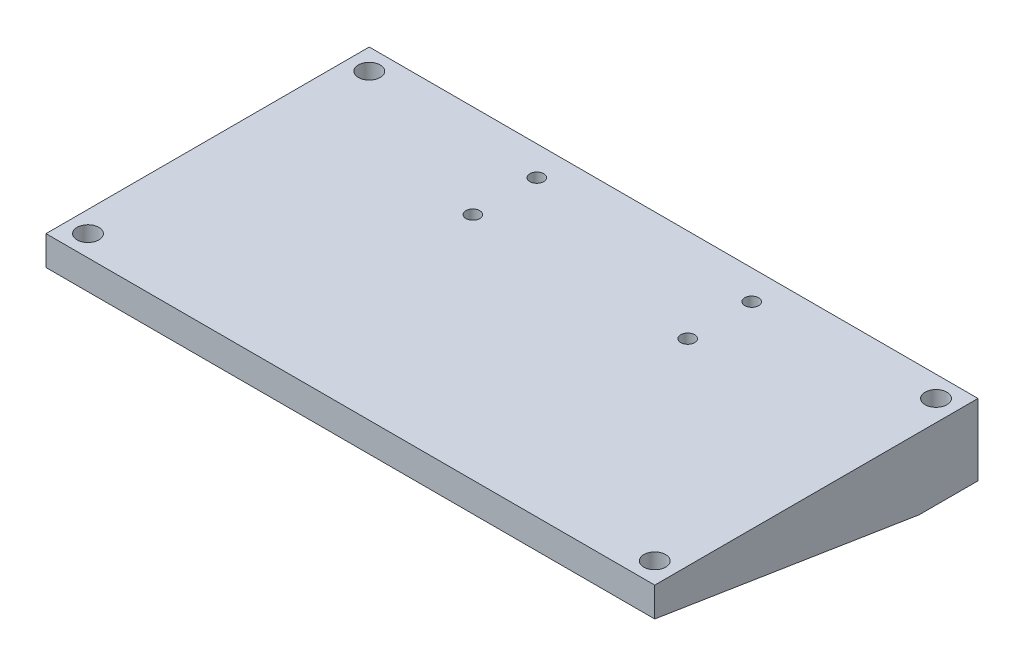
ISO-10303-21;
HEADER;
FILE_DESCRIPTION(('STEP AP214'),'2;1');
FILE_NAME('part.step','',(''),(''),'','','');
FILE_SCHEMA(('AUTOMOTIVE_DESIGN { 1 0 10303 214 1 1 1 1 }'));
ENDSEC;
DATA;
#1=APPLICATION_CONTEXT('core data for automotive mechanical design processes');
#2=APPLICATION_PROTOCOL_DEFINITION('international standard','automotive_design',2000,#1);
#3=PRODUCT_CONTEXT('',#1,'mechanical');
#4=PRODUCT('Part','Part','',(#3));
#5=PRODUCT_RELATED_PRODUCT_CATEGORY('part','',(#4));
#6=PRODUCT_DEFINITION_FORMATION('','',#4);
#7=PRODUCT_DEFINITION_CONTEXT('part definition',#1,'design');
#8=PRODUCT_DEFINITION('design','',#6,#7);
#9=PRODUCT_DEFINITION_SHAPE('','',#8);
#10=(LENGTH_UNIT() NAMED_UNIT(*) SI_UNIT(.MILLI.,.METRE.));
#11=(NAMED_UNIT(*) PLANE_ANGLE_UNIT() SI_UNIT($,.RADIAN.));
#12=(NAMED_UNIT(*) SI_UNIT($,.STERADIAN.) SOLID_ANGLE_UNIT());
#13=UNCERTAINTY_MEASURE_WITH_UNIT(LENGTH_MEASURE(1.E-05),#10,'distance_accuracy_value','');
#14=(GEOMETRIC_REPRESENTATION_CONTEXT(3) GLOBAL_UNCERTAINTY_ASSIGNED_CONTEXT((#13)) GLOBAL_UNIT_ASSIGNED_CONTEXT((#10,
#11,#12)) REPRESENTATION_CONTEXT('',''));
#15=CARTESIAN_POINT('',(0.,0.,0.));
#16=DIRECTION('',(0.,0.,1.));
#17=DIRECTION('',(1.,0.,0.));
#18=AXIS2_PLACEMENT_3D('',#15,#16,#17);
#19=CARTESIAN_POINT('',(0.,17.,0.));
#20=DIRECTION('',(1.,0.,0.));
#21=DIRECTION('',(0.,0.,-1.));
#22=AXIS2_PLACEMENT_3D('',#19,#20,#21);
#23=PLANE('',#22);
#24=DIRECTION('',(0.,0.,1.));
#25=VECTOR('',#24,1.);
#26=CARTESIAN_POINT('',(0.,0.,0.));
#27=LINE('',#26,#25);
#28=CARTESIAN_POINT('',(0.,0.,-77.));
#29=VERTEX_POINT('',#28);
#30=CARTESIAN_POINT('',(0.,0.,-63.0000000000014));
#31=VERTEX_POINT('',#30);
#32=EDGE_CURVE('E116',#29,#31,#27,.T.);
#33=ORIENTED_EDGE('',*,*,#32,.T.);
#34=DIRECTION('',(0.,0.156767544200705,0.987635528464463));
#35=VECTOR('',#34,1.);
#36=CARTESIAN_POINT('',(0.,10.,0.));
#37=LINE('',#36,#35);
#38=CARTESIAN_POINT('',(0.,10.,0.));
#39=VERTEX_POINT('',#38);
#40=EDGE_CURVE('E11',#31,#39,#37,.T.);
#41=ORIENTED_EDGE('',*,*,#40,.T.);
#42=DIRECTION('',(0.,-1.,0.));
#43=VECTOR('',#42,1.);
#44=CARTESIAN_POINT('',(0.,17.,0.));
#45=LINE('',#44,#43);
#46=CARTESIAN_POINT('',(0.,17.,0.));
#47=VERTEX_POINT('',#46);
#48=EDGE_CURVE('E84',#47,#39,#45,.T.);
#49=ORIENTED_EDGE('',*,*,#48,.F.);
#50=DIRECTION('',(0.,0.,1.));
#51=VECTOR('',#50,1.);
#52=CARTESIAN_POINT('',(0.,17.,0.));
#53=LINE('',#52,#51);
#54=CARTESIAN_POINT('',(0.,17.,-77.));
#55=VERTEX_POINT('',#54);
#56=EDGE_CURVE('E90',#55,#47,#53,.T.);
#57=ORIENTED_EDGE('',*,*,#56,.F.);
#58=DIRECTION('',(0.,-1.,0.));
#59=VECTOR('',#58,1.);
#60=CARTESIAN_POINT('',(0.,17.,-77.));
#61=LINE('',#60,#59);
#62=EDGE_CURVE('E111',#55,#29,#61,.T.);
#63=ORIENTED_EDGE('',*,*,#62,.T.);
#64=EDGE_LOOP('',(#33,#41,#49,#57,#63));
#65=FACE_BOUND('',#64,.T.);
#66=ADVANCED_FACE('F33',(#65),#23,.F.);
#67=CARTESIAN_POINT('',(0.,17.,0.));
#68=DIRECTION('',(0.,0.,-1.));
#69=DIRECTION('',(-1.,0.,0.));
#70=AXIS2_PLACEMENT_3D('',#67,#68,#69);
#71=PLANE('',#70);
#72=ORIENTED_EDGE('',*,*,#48,.T.);
#73=DIRECTION('',(1.,0.,0.));
#74=VECTOR('',#73,1.);
#75=CARTESIAN_POINT('',(145.,10.,0.));
#76=LINE('',#75,#74);
#77=CARTESIAN_POINT('',(145.,10.,0.));
#78=VERTEX_POINT('',#77);
#79=EDGE_CURVE('E102',#39,#78,#76,.T.);
#80=ORIENTED_EDGE('',*,*,#79,.T.);
#81=DIRECTION('',(0.,-1.,0.));
#82=VECTOR('',#81,1.);
#83=CARTESIAN_POINT('',(145.,17.,0.));
#84=LINE('',#83,#82);
#85=CARTESIAN_POINT('',(145.,17.,0.));
#86=VERTEX_POINT('',#85);
#87=EDGE_CURVE('E86',#86,#78,#84,.T.);
#88=ORIENTED_EDGE('',*,*,#87,.F.);
#89=DIRECTION('',(1.,0.,0.));
#90=VECTOR('',#89,1.);
#91=CARTESIAN_POINT('',(0.,17.,0.));
#92=LINE('',#91,#90);
#93=EDGE_CURVE('E79',#47,#86,#92,.T.);
#94=ORIENTED_EDGE('',*,*,#93,.F.);
#95=EDGE_LOOP('',(#72,#80,#88,#94));
#96=FACE_BOUND('',#95,.T.);
#97=ADVANCED_FACE('F81',(#96),#71,.F.);
#98=CARTESIAN_POINT('',(145.,17.,0.));
#99=DIRECTION('',(-1.,0.,0.));
#100=DIRECTION('',(0.,0.,1.));
#101=AXIS2_PLACEMENT_3D('',#98,#99,#100);
#102=PLANE('',#101);
#103=ORIENTED_EDGE('',*,*,#87,.T.);
#104=DIRECTION('',(0.,-0.156767544200705,-0.987635528464463));
#105=VECTOR('',#104,1.);
#106=CARTESIAN_POINT('',(145.,10.,0.));
#107=LINE('',#106,#105);
#108=CARTESIAN_POINT('',(145.,0.,-63.0000000000014));
#109=VERTEX_POINT('',#108);
#110=EDGE_CURVE('E55',#78,#109,#107,.T.);
#111=ORIENTED_EDGE('',*,*,#110,.T.);
#112=DIRECTION('',(0.,0.,-1.));
#113=VECTOR('',#112,1.);
#114=CARTESIAN_POINT('',(145.,0.,0.));
#115=LINE('',#114,#113);
#116=CARTESIAN_POINT('',(145.,0.,-77.));
#117=VERTEX_POINT('',#116);
#118=EDGE_CURVE('E114',#109,#117,#115,.T.);
#119=ORIENTED_EDGE('',*,*,#118,.T.);
#120=DIRECTION('',(0.,-1.,0.));
#121=VECTOR('',#120,1.);
#122=CARTESIAN_POINT('',(145.,17.,-77.));
#123=LINE('',#122,#121);
#124=CARTESIAN_POINT('',(145.,17.,-77.));
#125=VERTEX_POINT('',#124);
#126=EDGE_CURVE('E105',#125,#117,#123,.T.);
#127=ORIENTED_EDGE('',*,*,#126,.F.);
#128=DIRECTION('',(0.,0.,-1.));
#129=VECTOR('',#128,1.);
#130=CARTESIAN_POINT('',(145.,17.,0.));
#131=LINE('',#130,#129);
#132=EDGE_CURVE('E89',#86,#125,#131,.T.);
#133=ORIENTED_EDGE('',*,*,#132,.F.);
#134=EDGE_LOOP('',(#103,#111,#119,#127,#133));
#135=FACE_BOUND('',#134,.T.);
#136=ADVANCED_FACE('F208',(#135),#102,.F.);
#137=CARTESIAN_POINT('',(0.,17.,-77.));
#138=DIRECTION('',(0.,0.,1.));
#139=DIRECTION('',(1.,0.,0.));
#140=AXIS2_PLACEMENT_3D('',#137,#138,#139);
#141=PLANE('',#140);
#142=DIRECTION('',(-1.,0.,0.));
#143=VECTOR('',#142,1.);
#144=CARTESIAN_POINT('',(0.,0.,-77.));
#145=LINE('',#144,#143);
#146=EDGE_CURVE('E99',#117,#29,#145,.T.);
#147=ORIENTED_EDGE('',*,*,#146,.T.);
#148=ORIENTED_EDGE('',*,*,#62,.F.);
#149=DIRECTION('',(-1.,0.,0.));
#150=VECTOR('',#149,1.);
#151=CARTESIAN_POINT('',(0.,17.,-77.));
#152=LINE('',#151,#150);
#153=EDGE_CURVE('E95',#125,#55,#152,.T.);
#154=ORIENTED_EDGE('',*,*,#153,.F.);
#155=ORIENTED_EDGE('',*,*,#126,.T.);
#156=EDGE_LOOP('',(#147,#148,#154,#155));
#157=FACE_BOUND('',#156,.T.);
#158=ADVANCED_FACE('F181',(#157),#141,.F.);
#159=CARTESIAN_POINT('',(0.,17.,0.));
#160=DIRECTION('',(0.,-1.,0.));
#161=DIRECTION('',(0.,0.,-1.));
#162=AXIS2_PLACEMENT_3D('',#159,#160,#161);
#163=PLANE('',#162);
#164=CARTESIAN_POINT('',(5.,17.,-5.));
#165=DIRECTION('',(0.,1.,0.));
#166=DIRECTION('',(0.,0.,1.));
#167=AXIS2_PLACEMENT_3D('',#164,#165,#166);
#168=CIRCLE('',#167,2.6);
#169=CARTESIAN_POINT('',(5.,17.,-2.4));
#170=VERTEX_POINT('',#169);
#171=EDGE_CURVE('E146',#170,#170,#168,.T.);
#172=ORIENTED_EDGE('',*,*,#171,.F.);
#173=EDGE_LOOP('',(#172));
#174=FACE_BOUND('',#173,.T.);
#175=CARTESIAN_POINT('',(140.,17.,-5.));
#176=DIRECTION('',(0.,1.,0.));
#177=DIRECTION('',(0.,0.,1.));
#178=AXIS2_PLACEMENT_3D('',#175,#176,#177);
#179=CIRCLE('',#178,2.59999999999999);
#180=CARTESIAN_POINT('',(140.,17.,-2.40000000000001));
#181=VERTEX_POINT('',#180);
#182=EDGE_CURVE('E140',#181,#181,#179,.T.);
#183=ORIENTED_EDGE('',*,*,#182,.F.);
#184=EDGE_LOOP('',(#183));
#185=FACE_BOUND('',#184,.T.);
#186=CARTESIAN_POINT('',(140.,17.,-72.));
#187=DIRECTION('',(0.,1.,0.));
#188=DIRECTION('',(0.,0.,1.));
#189=AXIS2_PLACEMENT_3D('',#186,#187,#188);
#190=CIRCLE('',#189,2.59999999999999);
#191=CARTESIAN_POINT('',(140.,17.,-69.4));
#192=VERTEX_POINT('',#191);
#193=EDGE_CURVE('E134',#192,#192,#190,.T.);
#194=ORIENTED_EDGE('',*,*,#193,.F.);
#195=EDGE_LOOP('',(#194));
#196=FACE_BOUND('',#195,.T.);
#197=CARTESIAN_POINT('',(46.91,17.,-70.));
#198=DIRECTION('',(0.,1.,0.));
#199=DIRECTION('',(0.,0.,1.));
#200=AXIS2_PLACEMENT_3D('',#197,#198,#199);
#201=CIRCLE('',#200,1.65);
#202=CARTESIAN_POINT('',(46.91,17.,-68.35));
#203=VERTEX_POINT('',#202);
#204=EDGE_CURVE('E127',#203,#203,#201,.T.);
#205=ORIENTED_EDGE('',*,*,#204,.F.);
#206=EDGE_LOOP('',(#205));
#207=FACE_BOUND('',#206,.T.);
#208=CARTESIAN_POINT('',(98.09,17.,-54.76));
#209=DIRECTION('',(0.,1.,0.));
#210=DIRECTION('',(0.,0.,1.));
#211=AXIS2_PLACEMENT_3D('',#208,#209,#210);
#212=CIRCLE('',#211,1.65);
#213=CARTESIAN_POINT('',(98.09,17.,-53.11));
#214=VERTEX_POINT('',#213);
#215=EDGE_CURVE('E163',#214,#214,#212,.T.);
#216=ORIENTED_EDGE('',*,*,#215,.F.);
#217=EDGE_LOOP('',(#216));
#218=FACE_BOUND('',#217,.T.);
#219=CARTESIAN_POINT('',(98.09,17.,-70.));
#220=DIRECTION('',(0.,1.,0.));
#221=DIRECTION('',(0.,0.,1.));
#222=AXIS2_PLACEMENT_3D('',#219,#220,#221);
#223=CIRCLE('',#222,1.65);
#224=CARTESIAN_POINT('',(98.09,17.,-68.35));
#225=VERTEX_POINT('',#224);
#226=EDGE_CURVE('E151',#225,#225,#223,.T.);
#227=ORIENTED_EDGE('',*,*,#226,.F.);
#228=EDGE_LOOP('',(#227));
#229=FACE_BOUND('',#228,.T.);
#230=CARTESIAN_POINT('',(46.91,17.,-54.76));
#231=DIRECTION('',(0.,1.,0.));
#232=DIRECTION('',(0.,0.,1.));
#233=AXIS2_PLACEMENT_3D('',#230,#231,#232);
#234=CIRCLE('',#233,1.65);
#235=CARTESIAN_POINT('',(46.91,17.,-53.11));
#236=VERTEX_POINT('',#235);
#237=EDGE_CURVE('E158',#236,#236,#234,.T.);
#238=ORIENTED_EDGE('',*,*,#237,.F.);
#239=EDGE_LOOP('',(#238));
#240=FACE_BOUND('',#239,.T.);
#241=CARTESIAN_POINT('',(5.,17.,-72.));
#242=DIRECTION('',(0.,1.,0.));
#243=DIRECTION('',(0.,0.,1.));
#244=AXIS2_PLACEMENT_3D('',#241,#242,#243);
#245=CIRCLE('',#244,2.6);
#246=CARTESIAN_POINT('',(5.,17.,-69.4));
#247=VERTEX_POINT('',#246);
#248=EDGE_CURVE('E121',#247,#247,#245,.T.);
#249=ORIENTED_EDGE('',*,*,#248,.F.);
#250=EDGE_LOOP('',(#249));
#251=FACE_BOUND('',#250,.T.);
#252=ORIENTED_EDGE('',*,*,#56,.T.);
#253=ORIENTED_EDGE('',*,*,#93,.T.);
#254=ORIENTED_EDGE('',*,*,#132,.T.);
#255=ORIENTED_EDGE('',*,*,#153,.T.);
#256=EDGE_LOOP('',(#252,#253,#254,#255));
#257=FACE_BOUND('',#256,.T.);
#258=ADVANCED_FACE('F93',(#174,#185,#196,#207,#218,#229,#240,#251,#257),#163,.F.);
#259=CARTESIAN_POINT('',(0.,0.,0.));
#260=DIRECTION('',(0.,-1.,0.));
#261=DIRECTION('',(0.,0.,-1.));
#262=AXIS2_PLACEMENT_3D('',#259,#260,#261);
#263=PLANE('',#262);
#264=ORIENTED_EDGE('',*,*,#118,.F.);
#265=DIRECTION('',(-1.,0.,0.));
#266=VECTOR('',#265,1.);
#267=CARTESIAN_POINT('',(0.,0.,-63.0000000000014));
#268=LINE('',#267,#266);
#269=EDGE_CURVE('E41',#109,#31,#268,.T.);
#270=ORIENTED_EDGE('',*,*,#269,.T.);
#271=ORIENTED_EDGE('',*,*,#32,.F.);
#272=ORIENTED_EDGE('',*,*,#146,.F.);
#273=EDGE_LOOP('',(#264,#270,#271,#272));
#274=FACE_BOUND('',#273,.T.);
#275=ADVANCED_FACE('F180',(#274),#263,.T.);
#276=CARTESIAN_POINT('',(0.,10.,0.));
#277=DIRECTION('',(0.,-0.987635528464463,0.156767544200705));
#278=DIRECTION('',(-1.,0.,0.));
#279=AXIS2_PLACEMENT_3D('',#276,#277,#278);
#280=PLANE('',#279);
#281=ORIENTED_EDGE('',*,*,#40,.F.);
#282=ORIENTED_EDGE('',*,*,#269,.F.);
#283=ORIENTED_EDGE('',*,*,#110,.F.);
#284=ORIENTED_EDGE('',*,*,#79,.F.);
#285=EDGE_LOOP('',(#281,#282,#283,#284));
#286=FACE_BOUND('',#285,.T.);
#287=ADVANCED_FACE('F35',(#286),#280,.T.);
#288=CARTESIAN_POINT('',(5.,12.,-72.));
#289=DIRECTION('',(0.,1.,0.));
#290=DIRECTION('',(0.,0.,1.));
#291=AXIS2_PLACEMENT_3D('',#288,#289,#290);
#292=CYLINDRICAL_SURFACE('',#291,2.6);
#293=CARTESIAN_POINT('',(5.,12.,-72.));
#294=DIRECTION('',(0.,1.,0.));
#295=DIRECTION('',(0.,0.,1.));
#296=AXIS2_PLACEMENT_3D('',#293,#294,#295);
#297=CIRCLE('',#296,2.6);
#298=CARTESIAN_POINT('',(5.,12.,-69.4));
#299=VERTEX_POINT('',#298);
#300=EDGE_CURVE('E118',#299,#299,#297,.T.);
#301=ORIENTED_EDGE('',*,*,#300,.F.);
#302=EDGE_LOOP('',(#301));
#303=FACE_BOUND('',#302,.T.);
#304=ORIENTED_EDGE('',*,*,#248,.T.);
#305=EDGE_LOOP('',(#304));
#306=FACE_BOUND('',#305,.T.);
#307=ADVANCED_FACE('F190',(#303,#306),#292,.F.);
#308=CARTESIAN_POINT('',(0.,12.,0.));
#309=DIRECTION('',(0.,1.,0.));
#310=DIRECTION('',(0.,0.,1.));
#311=AXIS2_PLACEMENT_3D('',#308,#309,#310);
#312=PLANE('',#311);
#313=ORIENTED_EDGE('',*,*,#300,.T.);
#314=EDGE_LOOP('',(#313));
#315=FACE_BOUND('',#314,.T.);
#316=ADVANCED_FACE('F192',(#315),#312,.T.);
#317=CARTESIAN_POINT('',(46.91,12.,-54.76));
#318=DIRECTION('',(0.,1.,0.));
#319=DIRECTION('',(0.,0.,1.));
#320=AXIS2_PLACEMENT_3D('',#317,#318,#319);
#321=CYLINDRICAL_SURFACE('',#320,1.65);
#322=CARTESIAN_POINT('',(46.91,12.,-54.76));
#323=DIRECTION('',(0.,1.,0.));
#324=DIRECTION('',(0.,0.,1.));
#325=AXIS2_PLACEMENT_3D('',#322,#323,#324);
#326=CIRCLE('',#325,1.65);
#327=CARTESIAN_POINT('',(46.91,12.,-53.11));
#328=VERTEX_POINT('',#327);
#329=EDGE_CURVE('E131',#328,#328,#326,.T.);
#330=ORIENTED_EDGE('',*,*,#329,.F.);
#331=EDGE_LOOP('',(#330));
#332=FACE_BOUND('',#331,.T.);
#333=ORIENTED_EDGE('',*,*,#237,.T.);
#334=EDGE_LOOP('',(#333));
#335=FACE_BOUND('',#334,.T.);
#336=ADVANCED_FACE('F199',(#332,#335),#321,.F.);
#337=CARTESIAN_POINT('',(0.,12.,0.));
#338=DIRECTION('',(0.,1.,0.));
#339=DIRECTION('',(0.,0.,1.));
#340=AXIS2_PLACEMENT_3D('',#337,#338,#339);
#341=PLANE('',#340);
#342=ORIENTED_EDGE('',*,*,#329,.T.);
#343=EDGE_LOOP('',(#342));
#344=FACE_BOUND('',#343,.T.);
#345=ADVANCED_FACE('F252',(#344),#341,.T.);
#346=CARTESIAN_POINT('',(98.09,12.,-70.));
#347=DIRECTION('',(0.,1.,0.));
#348=DIRECTION('',(0.,0.,1.));
#349=AXIS2_PLACEMENT_3D('',#346,#347,#348);
#350=CYLINDRICAL_SURFACE('',#349,1.65);
#351=CARTESIAN_POINT('',(98.09,12.,-70.));
#352=DIRECTION('',(0.,1.,0.));
#353=DIRECTION('',(0.,0.,1.));
#354=AXIS2_PLACEMENT_3D('',#351,#352,#353);
#355=CIRCLE('',#354,1.65);
#356=CARTESIAN_POINT('',(98.09,12.,-68.35));
#357=VERTEX_POINT('',#356);
#358=EDGE_CURVE('E154',#357,#357,#355,.T.);
#359=ORIENTED_EDGE('',*,*,#358,.F.);
#360=EDGE_LOOP('',(#359));
#361=FACE_BOUND('',#360,.T.);
#362=ORIENTED_EDGE('',*,*,#226,.T.);
#363=EDGE_LOOP('',(#362));
#364=FACE_BOUND('',#363,.T.);
#365=ADVANCED_FACE('F262',(#361,#364),#350,.F.);
#366=CARTESIAN_POINT('',(0.,12.,0.));
#367=DIRECTION('',(0.,1.,0.));
#368=DIRECTION('',(0.,0.,1.));
#369=AXIS2_PLACEMENT_3D('',#366,#367,#368);
#370=PLANE('',#369);
#371=ORIENTED_EDGE('',*,*,#358,.T.);
#372=EDGE_LOOP('',(#371));
#373=FACE_BOUND('',#372,.T.);
#374=ADVANCED_FACE('F174',(#373),#370,.T.);
#375=CARTESIAN_POINT('',(98.09,12.,-54.76));
#376=DIRECTION('',(0.,1.,0.));
#377=DIRECTION('',(0.,0.,1.));
#378=AXIS2_PLACEMENT_3D('',#375,#376,#377);
#379=CYLINDRICAL_SURFACE('',#378,1.65);
#380=CARTESIAN_POINT('',(98.09,12.,-54.76));
#381=DIRECTION('',(0.,1.,0.));
#382=DIRECTION('',(0.,0.,1.));
#383=AXIS2_PLACEMENT_3D('',#380,#381,#382);
#384=CIRCLE('',#383,1.65);
#385=CARTESIAN_POINT('',(98.09,12.,-53.11));
#386=VERTEX_POINT('',#385);
#387=EDGE_CURVE('E155',#386,#386,#384,.T.);
#388=ORIENTED_EDGE('',*,*,#387,.F.);
#389=EDGE_LOOP('',(#388));
#390=FACE_BOUND('',#389,.T.);
#391=ORIENTED_EDGE('',*,*,#215,.T.);
#392=EDGE_LOOP('',(#391));
#393=FACE_BOUND('',#392,.T.);
#394=ADVANCED_FACE('F171',(#390,#393),#379,.F.);
#395=CARTESIAN_POINT('',(0.,12.,0.));
#396=DIRECTION('',(0.,1.,0.));
#397=DIRECTION('',(0.,0.,1.));
#398=AXIS2_PLACEMENT_3D('',#395,#396,#397);
#399=PLANE('',#398);
#400=ORIENTED_EDGE('',*,*,#387,.T.);
#401=EDGE_LOOP('',(#400));
#402=FACE_BOUND('',#401,.T.);
#403=ADVANCED_FACE('F169',(#402),#399,.T.);
#404=CARTESIAN_POINT('',(46.91,12.,-70.));
#405=DIRECTION('',(0.,1.,0.));
#406=DIRECTION('',(0.,0.,1.));
#407=AXIS2_PLACEMENT_3D('',#404,#405,#406);
#408=CYLINDRICAL_SURFACE('',#407,1.65);
#409=CARTESIAN_POINT('',(46.91,12.,-70.));
#410=DIRECTION('',(0.,1.,0.));
#411=DIRECTION('',(0.,0.,1.));
#412=AXIS2_PLACEMENT_3D('',#409,#410,#411);
#413=CIRCLE('',#412,1.65);
#414=CARTESIAN_POINT('',(46.91,12.,-68.35));
#415=VERTEX_POINT('',#414);
#416=EDGE_CURVE('E130',#415,#415,#413,.T.);
#417=ORIENTED_EDGE('',*,*,#416,.F.);
#418=EDGE_LOOP('',(#417));
#419=FACE_BOUND('',#418,.T.);
#420=ORIENTED_EDGE('',*,*,#204,.T.);
#421=EDGE_LOOP('',(#420));
#422=FACE_BOUND('',#421,.T.);
#423=ADVANCED_FACE('F296',(#419,#422),#408,.F.);
#424=CARTESIAN_POINT('',(0.,12.,0.));
#425=DIRECTION('',(0.,1.,0.));
#426=DIRECTION('',(0.,0.,1.));
#427=AXIS2_PLACEMENT_3D('',#424,#425,#426);
#428=PLANE('',#427);
#429=ORIENTED_EDGE('',*,*,#416,.T.);
#430=EDGE_LOOP('',(#429));
#431=FACE_BOUND('',#430,.T.);
#432=ADVANCED_FACE('F305',(#431),#428,.T.);
#433=CARTESIAN_POINT('',(140.,12.,-72.));
#434=DIRECTION('',(0.,1.,0.));
#435=DIRECTION('',(0.,0.,1.));
#436=AXIS2_PLACEMENT_3D('',#433,#434,#435);
#437=CYLINDRICAL_SURFACE('',#436,2.59999999999999);
#438=CARTESIAN_POINT('',(140.,12.,-72.));
#439=DIRECTION('',(0.,1.,0.));
#440=DIRECTION('',(0.,0.,1.));
#441=AXIS2_PLACEMENT_3D('',#438,#439,#440);
#442=CIRCLE('',#441,2.59999999999999);
#443=CARTESIAN_POINT('',(140.,12.,-69.4));
#444=VERTEX_POINT('',#443);
#445=EDGE_CURVE('E137',#444,#444,#442,.T.);
#446=ORIENTED_EDGE('',*,*,#445,.F.);
#447=EDGE_LOOP('',(#446));
#448=FACE_BOUND('',#447,.T.);
#449=ORIENTED_EDGE('',*,*,#193,.T.);
#450=EDGE_LOOP('',(#449));
#451=FACE_BOUND('',#450,.T.);
#452=ADVANCED_FACE('F315',(#448,#451),#437,.F.);
#453=CARTESIAN_POINT('',(0.,12.,0.));
#454=DIRECTION('',(0.,1.,0.));
#455=DIRECTION('',(0.,0.,1.));
#456=AXIS2_PLACEMENT_3D('',#453,#454,#455);
#457=PLANE('',#456);
#458=ORIENTED_EDGE('',*,*,#445,.T.);
#459=EDGE_LOOP('',(#458));
#460=FACE_BOUND('',#459,.T.);
#461=ADVANCED_FACE('F325',(#460),#457,.T.);
#462=CARTESIAN_POINT('',(140.,12.,-5.));
#463=DIRECTION('',(0.,1.,0.));
#464=DIRECTION('',(0.,0.,1.));
#465=AXIS2_PLACEMENT_3D('',#462,#463,#464);
#466=CYLINDRICAL_SURFACE('',#465,2.59999999999999);
#467=CARTESIAN_POINT('',(140.,12.,-5.));
#468=DIRECTION('',(0.,1.,0.));
#469=DIRECTION('',(0.,0.,1.));
#470=AXIS2_PLACEMENT_3D('',#467,#468,#469);
#471=CIRCLE('',#470,2.59999999999999);
#472=CARTESIAN_POINT('',(140.,12.,-2.40000000000001));
#473=VERTEX_POINT('',#472);
#474=EDGE_CURVE('E143',#473,#473,#471,.T.);
#475=ORIENTED_EDGE('',*,*,#474,.F.);
#476=EDGE_LOOP('',(#475));
#477=FACE_BOUND('',#476,.T.);
#478=ORIENTED_EDGE('',*,*,#182,.T.);
#479=EDGE_LOOP('',(#478));
#480=FACE_BOUND('',#479,.T.);
#481=ADVANCED_FACE('F335',(#477,#480),#466,.F.);
#482=CARTESIAN_POINT('',(0.,12.,0.));
#483=DIRECTION('',(0.,1.,0.));
#484=DIRECTION('',(0.,0.,1.));
#485=AXIS2_PLACEMENT_3D('',#482,#483,#484);
#486=PLANE('',#485);
#487=ORIENTED_EDGE('',*,*,#474,.T.);
#488=EDGE_LOOP('',(#487));
#489=FACE_BOUND('',#488,.T.);
#490=ADVANCED_FACE('F345',(#489),#486,.T.);
#491=CARTESIAN_POINT('',(5.,12.,-5.));
#492=DIRECTION('',(0.,1.,0.));
#493=DIRECTION('',(0.,0.,1.));
#494=AXIS2_PLACEMENT_3D('',#491,#492,#493);
#495=CYLINDRICAL_SURFACE('',#494,2.6);
#496=CARTESIAN_POINT('',(5.,12.,-5.));
#497=DIRECTION('',(0.,1.,0.));
#498=DIRECTION('',(0.,0.,1.));
#499=AXIS2_PLACEMENT_3D('',#496,#497,#498);
#500=CIRCLE('',#499,2.6);
#501=CARTESIAN_POINT('',(5.,12.,-2.4));
#502=VERTEX_POINT('',#501);
#503=EDGE_CURVE('E124',#502,#502,#500,.T.);
#504=ORIENTED_EDGE('',*,*,#503,.F.);
#505=EDGE_LOOP('',(#504));
#506=FACE_BOUND('',#505,.T.);
#507=ORIENTED_EDGE('',*,*,#171,.T.);
#508=EDGE_LOOP('',(#507));
#509=FACE_BOUND('',#508,.T.);
#510=ADVANCED_FACE('F355',(#506,#509),#495,.F.);
#511=CARTESIAN_POINT('',(0.,12.,0.));
#512=DIRECTION('',(0.,1.,0.));
#513=DIRECTION('',(0.,0.,1.));
#514=AXIS2_PLACEMENT_3D('',#511,#512,#513);
#515=PLANE('',#514);
#516=ORIENTED_EDGE('',*,*,#503,.T.);
#517=EDGE_LOOP('',(#516));
#518=FACE_BOUND('',#517,.T.);
#519=ADVANCED_FACE('F365',(#518),#515,.T.);
#520=CLOSED_SHELL('',(#66,#97,#136,#158,#258,#275,#287,#307,#316,#336,#345,#365,#374,#394,#403,
#423,#432,#452,#461,#481,#490,#510,#519));
#521=MANIFOLD_SOLID_BREP('B2',#520);
#522=ADVANCED_BREP_SHAPE_REPRESENTATION('',(#18,#521),#14);
#523=SHAPE_DEFINITION_REPRESENTATION(#9,#522);
ENDSEC;
END-ISO-10303-21;
